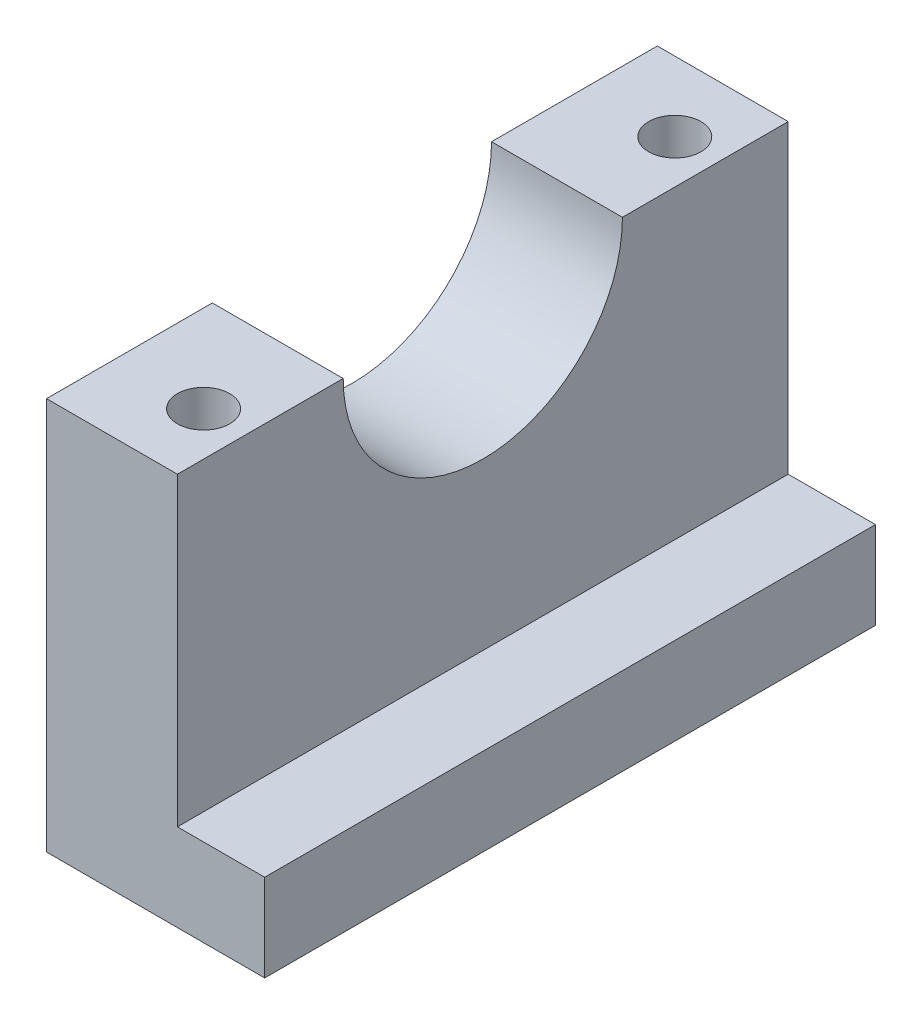
ISO-10303-21;
HEADER;
FILE_DESCRIPTION(('STEP AP214'),'2;1');
FILE_NAME('part.step','',(''),(''),'','','');
FILE_SCHEMA(('AUTOMOTIVE_DESIGN { 1 0 10303 214 1 1 1 1 }'));
ENDSEC;
DATA;
#1=APPLICATION_CONTEXT('core data for automotive mechanical design processes');
#2=APPLICATION_PROTOCOL_DEFINITION('international standard','automotive_design',2000,#1);
#3=PRODUCT_CONTEXT('',#1,'mechanical');
#4=PRODUCT('Part','Part','',(#3));
#5=PRODUCT_RELATED_PRODUCT_CATEGORY('part','',(#4));
#6=PRODUCT_DEFINITION_FORMATION('','',#4);
#7=PRODUCT_DEFINITION_CONTEXT('part definition',#1,'design');
#8=PRODUCT_DEFINITION('design','',#6,#7);
#9=PRODUCT_DEFINITION_SHAPE('','',#8);
#10=(LENGTH_UNIT() NAMED_UNIT(*) SI_UNIT(.MILLI.,.METRE.));
#11=(NAMED_UNIT(*) PLANE_ANGLE_UNIT() SI_UNIT($,.RADIAN.));
#12=(NAMED_UNIT(*) SI_UNIT($,.STERADIAN.) SOLID_ANGLE_UNIT());
#13=UNCERTAINTY_MEASURE_WITH_UNIT(LENGTH_MEASURE(1.E-05),#10,'distance_accuracy_value','');
#14=(GEOMETRIC_REPRESENTATION_CONTEXT(3) GLOBAL_UNCERTAINTY_ASSIGNED_CONTEXT((#13)) GLOBAL_UNIT_ASSIGNED_CONTEXT((#10,
#11,#12)) REPRESENTATION_CONTEXT('',''));
#15=CARTESIAN_POINT('',(0.,0.,0.));
#16=DIRECTION('',(0.,0.,1.));
#17=DIRECTION('',(1.,0.,0.));
#18=AXIS2_PLACEMENT_3D('',#15,#16,#17);
#19=CARTESIAN_POINT('',(10.,45.,27.));
#20=DIRECTION('',(0.,-1.,0.));
#21=DIRECTION('',(0.,0.,-1.));
#22=AXIS2_PLACEMENT_3D('',#19,#20,#21);
#23=CYLINDRICAL_SURFACE('',#22,3.);
#24=CARTESIAN_POINT('',(10.,45.,27.));
#25=DIRECTION('',(0.,1.,0.));
#26=DIRECTION('',(0.,0.,1.));
#27=AXIS2_PLACEMENT_3D('',#24,#25,#26);
#28=CIRCLE('',#27,3.);
#29=CARTESIAN_POINT('',(10.,45.,24.));
#30=VERTEX_POINT('',#29);
#31=EDGE_CURVE('E153',#30,#30,#28,.T.);
#32=CARTESIAN_POINT('',(10.,7.,27.));
#33=DIRECTION('',(0.,-1.,0.));
#34=DIRECTION('',(0.,0.,-1.));
#35=AXIS2_PLACEMENT_3D('',#32,#33,#34);
#36=CIRCLE('',#35,3.);
#37=CARTESIAN_POINT('',(10.,7.,24.));
#38=VERTEX_POINT('',#37);
#39=EDGE_CURVE('E43',#38,#38,#36,.T.);
#40=CARTESIAN_POINT('',(10.,45.,24.));
#41=CARTESIAN_POINT('',(10.,44.6041666666667,24.));
#42=CARTESIAN_POINT('',(10.,44.2083333333333,24.));
#43=CARTESIAN_POINT('',(10.,43.4166666666667,24.));
#44=CARTESIAN_POINT('',(10.,43.0208333333333,24.));
#45=CARTESIAN_POINT('',(10.,42.2291666666667,24.));
#46=CARTESIAN_POINT('',(10.,41.8333333333333,24.));
#47=CARTESIAN_POINT('',(10.,41.0416666666667,24.));
#48=CARTESIAN_POINT('',(10.,40.6458333333333,24.));
#49=CARTESIAN_POINT('',(10.,39.8541666666667,24.));
#50=CARTESIAN_POINT('',(10.,39.4583333333333,24.));
#51=CARTESIAN_POINT('',(10.,38.6666666666667,24.));
#52=CARTESIAN_POINT('',(10.,38.2708333333333,24.));
#53=CARTESIAN_POINT('',(10.,37.4791666666667,24.));
#54=CARTESIAN_POINT('',(10.,37.0833333333333,24.));
#55=CARTESIAN_POINT('',(10.,36.2916666666667,24.));
#56=CARTESIAN_POINT('',(10.,35.8958333333333,24.));
#57=CARTESIAN_POINT('',(10.,35.1041666666667,24.));
#58=CARTESIAN_POINT('',(10.,34.7083333333333,24.));
#59=CARTESIAN_POINT('',(10.,33.9166666666667,24.));
#60=CARTESIAN_POINT('',(10.,33.5208333333333,24.));
#61=CARTESIAN_POINT('',(10.,32.7291666666667,24.));
#62=CARTESIAN_POINT('',(10.,32.3333333333333,24.));
#63=CARTESIAN_POINT('',(10.,31.5416666666667,24.));
#64=CARTESIAN_POINT('',(10.,31.1458333333333,24.));
#65=CARTESIAN_POINT('',(10.,30.3541666666667,24.));
#66=CARTESIAN_POINT('',(10.,29.9583333333333,24.));
#67=CARTESIAN_POINT('',(10.,29.1666666666667,24.));
#68=CARTESIAN_POINT('',(10.,28.7708333333333,24.));
#69=CARTESIAN_POINT('',(10.,27.9791666666667,24.));
#70=CARTESIAN_POINT('',(10.,27.5833333333333,24.));
#71=CARTESIAN_POINT('',(10.,26.7916666666667,24.));
#72=CARTESIAN_POINT('',(10.,26.3958333333333,24.));
#73=CARTESIAN_POINT('',(10.,25.6041666666667,24.));
#74=CARTESIAN_POINT('',(10.,25.2083333333333,24.));
#75=CARTESIAN_POINT('',(10.,24.4166666666667,24.));
#76=CARTESIAN_POINT('',(10.,24.0208333333333,24.));
#77=CARTESIAN_POINT('',(10.,23.2291666666667,24.));
#78=CARTESIAN_POINT('',(10.,22.8333333333333,24.));
#79=CARTESIAN_POINT('',(10.,22.0416666666667,24.));
#80=CARTESIAN_POINT('',(10.,21.6458333333333,24.));
#81=CARTESIAN_POINT('',(10.,20.8541666666667,24.));
#82=CARTESIAN_POINT('',(10.,20.4583333333333,24.));
#83=CARTESIAN_POINT('',(10.,19.6666666666667,24.));
#84=CARTESIAN_POINT('',(10.,19.2708333333333,24.));
#85=CARTESIAN_POINT('',(10.,18.4791666666667,24.));
#86=CARTESIAN_POINT('',(10.,18.0833333333333,24.));
#87=CARTESIAN_POINT('',(10.,17.2916666666667,24.));
#88=CARTESIAN_POINT('',(10.,16.8958333333333,24.));
#89=CARTESIAN_POINT('',(10.,16.1041666666667,24.));
#90=CARTESIAN_POINT('',(10.,15.7083333333333,24.));
#91=CARTESIAN_POINT('',(10.,14.9166666666667,24.));
#92=CARTESIAN_POINT('',(10.,14.5208333333333,24.));
#93=CARTESIAN_POINT('',(10.,13.7291666666667,24.));
#94=CARTESIAN_POINT('',(10.,13.3333333333333,24.));
#95=CARTESIAN_POINT('',(10.,12.5416666666667,24.));
#96=CARTESIAN_POINT('',(10.,12.1458333333333,24.));
#97=CARTESIAN_POINT('',(10.,11.3541666666667,24.));
#98=CARTESIAN_POINT('',(10.,10.9583333333333,24.));
#99=CARTESIAN_POINT('',(10.,10.1666666666667,24.));
#100=CARTESIAN_POINT('',(10.,9.77083333333333,24.));
#101=CARTESIAN_POINT('',(10.,8.97916666666667,24.));
#102=CARTESIAN_POINT('',(10.,8.58333333333333,24.));
#103=CARTESIAN_POINT('',(10.,7.79166666666667,24.));
#104=CARTESIAN_POINT('',(10.,7.39583333333333,24.));
#105=CARTESIAN_POINT('',(10.,7.,24.));
#106=B_SPLINE_CURVE_WITH_KNOTS('',3,(#40,#41,#42,#43,#44,#45,#46,#47,#48,#49,#50,#51,#52,#53,
#54,#55,#56,#57,#58,#59,#60,#61,#62,#63,#64,#65,#66,#67,#68,#69,#70,#71,#72,#73,#74,#75,#76,#77,
#78,#79,#80,#81,#82,#83,#84,#85,#86,#87,#88,#89,#90,#91,#92,#93,#94,#95,#96,#97,#98,#99,#100,
#101,#102,#103,#104,#105),.UNSPECIFIED.,.F.,.F.,(4,2,2,2,2,2,2,2,2,2,2,2,2,2,2,2,2,2,2,2,2,2,2,
2,2,2,2,2,2,2,2,2,4),(0.,1.1875,2.375,3.5625,4.75,5.93750000000001,7.12500000000001,8.3125,9.5,
10.6875,11.875,13.0625,14.25,15.4375,16.625,17.8125,19.,20.1875,21.375,22.5625,23.75,24.9375,
26.125,27.3125,28.5,29.6875,30.875,32.0625,33.25,34.4375,35.625,36.8125,38.),.UNSPECIFIED.);
#107=EDGE_CURVE('BSEAM39',#30,#38,#106,.T.);
#108=ORIENTED_EDGE('',*,*,#31,.T.);
#109=ORIENTED_EDGE('',*,*,#39,.T.);
#110=ORIENTED_EDGE('',*,*,#107,.T.);
#111=ORIENTED_EDGE('',*,*,#107,.F.);
#112=EDGE_LOOP('',(#108,#110,#109,#111));
#113=FACE_BOUND('',#112,.T.);
#114=ADVANCED_FACE('F39',(#113),#23,.F.);
#115=CARTESIAN_POINT('',(10.,45.,-27.));
#116=DIRECTION('',(0.,-1.,0.));
#117=DIRECTION('',(0.,0.,-1.));
#118=AXIS2_PLACEMENT_3D('',#115,#116,#117);
#119=CYLINDRICAL_SURFACE('',#118,3.);
#120=CARTESIAN_POINT('',(10.,45.,-27.));
#121=DIRECTION('',(0.,1.,0.));
#122=DIRECTION('',(0.,0.,1.));
#123=AXIS2_PLACEMENT_3D('',#120,#121,#122);
#124=CIRCLE('',#123,3.);
#125=CARTESIAN_POINT('',(10.,45.,-30.));
#126=VERTEX_POINT('',#125);
#127=EDGE_CURVE('E152',#126,#126,#124,.T.);
#128=CARTESIAN_POINT('',(10.,7.,-27.));
#129=DIRECTION('',(0.,-1.,0.));
#130=DIRECTION('',(0.,0.,-1.));
#131=AXIS2_PLACEMENT_3D('',#128,#129,#130);
#132=CIRCLE('',#131,3.);
#133=CARTESIAN_POINT('',(10.,7.,-30.));
#134=VERTEX_POINT('',#133);
#135=EDGE_CURVE('E204',#134,#134,#132,.T.);
#136=CARTESIAN_POINT('',(10.,45.,-30.));
#137=CARTESIAN_POINT('',(10.,44.6041666666667,-30.));
#138=CARTESIAN_POINT('',(10.,44.2083333333333,-30.));
#139=CARTESIAN_POINT('',(10.,43.4166666666667,-30.));
#140=CARTESIAN_POINT('',(10.,43.0208333333333,-30.));
#141=CARTESIAN_POINT('',(10.,42.2291666666667,-30.));
#142=CARTESIAN_POINT('',(10.,41.8333333333333,-30.));
#143=CARTESIAN_POINT('',(10.,41.0416666666667,-30.));
#144=CARTESIAN_POINT('',(10.,40.6458333333333,-30.));
#145=CARTESIAN_POINT('',(10.,39.8541666666667,-30.));
#146=CARTESIAN_POINT('',(10.,39.4583333333333,-30.));
#147=CARTESIAN_POINT('',(10.,38.6666666666667,-30.));
#148=CARTESIAN_POINT('',(10.,38.2708333333333,-30.));
#149=CARTESIAN_POINT('',(10.,37.4791666666667,-30.));
#150=CARTESIAN_POINT('',(10.,37.0833333333333,-30.));
#151=CARTESIAN_POINT('',(10.,36.2916666666667,-30.));
#152=CARTESIAN_POINT('',(10.,35.8958333333333,-30.));
#153=CARTESIAN_POINT('',(10.,35.1041666666667,-30.));
#154=CARTESIAN_POINT('',(10.,34.7083333333333,-30.));
#155=CARTESIAN_POINT('',(10.,33.9166666666667,-30.));
#156=CARTESIAN_POINT('',(10.,33.5208333333333,-30.));
#157=CARTESIAN_POINT('',(10.,32.7291666666667,-30.));
#158=CARTESIAN_POINT('',(10.,32.3333333333333,-30.));
#159=CARTESIAN_POINT('',(10.,31.5416666666667,-30.));
#160=CARTESIAN_POINT('',(10.,31.1458333333333,-30.));
#161=CARTESIAN_POINT('',(10.,30.3541666666667,-30.));
#162=CARTESIAN_POINT('',(10.,29.9583333333333,-30.));
#163=CARTESIAN_POINT('',(10.,29.1666666666667,-30.));
#164=CARTESIAN_POINT('',(10.,28.7708333333333,-30.));
#165=CARTESIAN_POINT('',(10.,27.9791666666667,-30.));
#166=CARTESIAN_POINT('',(10.,27.5833333333333,-30.));
#167=CARTESIAN_POINT('',(10.,26.7916666666667,-30.));
#168=CARTESIAN_POINT('',(10.,26.3958333333333,-30.));
#169=CARTESIAN_POINT('',(10.,25.6041666666667,-30.));
#170=CARTESIAN_POINT('',(10.,25.2083333333333,-30.));
#171=CARTESIAN_POINT('',(10.,24.4166666666667,-30.));
#172=CARTESIAN_POINT('',(10.,24.0208333333333,-30.));
#173=CARTESIAN_POINT('',(10.,23.2291666666667,-30.));
#174=CARTESIAN_POINT('',(10.,22.8333333333333,-30.));
#175=CARTESIAN_POINT('',(10.,22.0416666666667,-30.));
#176=CARTESIAN_POINT('',(10.,21.6458333333333,-30.));
#177=CARTESIAN_POINT('',(10.,20.8541666666667,-30.));
#178=CARTESIAN_POINT('',(10.,20.4583333333333,-30.));
#179=CARTESIAN_POINT('',(10.,19.6666666666667,-30.));
#180=CARTESIAN_POINT('',(10.,19.2708333333333,-30.));
#181=CARTESIAN_POINT('',(10.,18.4791666666667,-30.));
#182=CARTESIAN_POINT('',(10.,18.0833333333333,-30.));
#183=CARTESIAN_POINT('',(10.,17.2916666666667,-30.));
#184=CARTESIAN_POINT('',(10.,16.8958333333333,-30.));
#185=CARTESIAN_POINT('',(10.,16.1041666666667,-30.));
#186=CARTESIAN_POINT('',(10.,15.7083333333333,-30.));
#187=CARTESIAN_POINT('',(10.,14.9166666666667,-30.));
#188=CARTESIAN_POINT('',(10.,14.5208333333333,-30.));
#189=CARTESIAN_POINT('',(10.,13.7291666666667,-30.));
#190=CARTESIAN_POINT('',(10.,13.3333333333333,-30.));
#191=CARTESIAN_POINT('',(10.,12.5416666666667,-30.));
#192=CARTESIAN_POINT('',(10.,12.1458333333333,-30.));
#193=CARTESIAN_POINT('',(10.,11.3541666666667,-30.));
#194=CARTESIAN_POINT('',(10.,10.9583333333333,-30.));
#195=CARTESIAN_POINT('',(10.,10.1666666666667,-30.));
#196=CARTESIAN_POINT('',(10.,9.77083333333333,-30.));
#197=CARTESIAN_POINT('',(10.,8.97916666666667,-30.));
#198=CARTESIAN_POINT('',(10.,8.58333333333333,-30.));
#199=CARTESIAN_POINT('',(10.,7.79166666666667,-30.));
#200=CARTESIAN_POINT('',(10.,7.39583333333333,-30.));
#201=CARTESIAN_POINT('',(10.,7.,-30.));
#202=B_SPLINE_CURVE_WITH_KNOTS('',3,(#136,#137,#138,#139,#140,#141,#142,#143,#144,#145,#146,
#147,#148,#149,#150,#151,#152,#153,#154,#155,#156,#157,#158,#159,#160,#161,#162,#163,#164,#165,
#166,#167,#168,#169,#170,#171,#172,#173,#174,#175,#176,#177,#178,#179,#180,#181,#182,#183,#184,
#185,#186,#187,#188,#189,#190,#191,#192,#193,#194,#195,#196,#197,#198,#199,#200,#201),
.UNSPECIFIED.,.F.,.F.,(4,2,2,2,2,2,2,2,2,2,2,2,2,2,2,2,2,2,2,2,2,2,2,2,2,2,2,2,2,2,2,2,4),(0.,
1.1875,2.375,3.5625,4.75,5.93750000000001,7.12500000000001,8.3125,9.5,10.6875,11.875,13.0625,
14.25,15.4375,16.625,17.8125,19.,20.1875,21.375,22.5625,23.75,24.9375,26.125,27.3125,28.5,
29.6875,30.875,32.0625,33.25,34.4375,35.625,36.8125,38.),.UNSPECIFIED.);
#203=EDGE_CURVE('BSEAM242',#126,#134,#202,.T.);
#204=ORIENTED_EDGE('',*,*,#127,.T.);
#205=ORIENTED_EDGE('',*,*,#135,.T.);
#206=ORIENTED_EDGE('',*,*,#203,.T.);
#207=ORIENTED_EDGE('',*,*,#203,.F.);
#208=EDGE_LOOP('',(#204,#206,#205,#207));
#209=FACE_BOUND('',#208,.T.);
#210=ADVANCED_FACE('F242',(#209),#119,.F.);
#211=CARTESIAN_POINT('',(15.,0.,35.));
#212=DIRECTION('',(0.,0.,-1.));
#213=DIRECTION('',(-1.,0.,0.));
#214=AXIS2_PLACEMENT_3D('',#211,#212,#213);
#215=PLANE('',#214);
#216=DIRECTION('',(0.,-1.,0.));
#217=VECTOR('',#216,1.);
#218=CARTESIAN_POINT('',(0.,0.,35.));
#219=LINE('',#218,#217);
#220=CARTESIAN_POINT('',(0.,45.,35.));
#221=VERTEX_POINT('',#220);
#222=CARTESIAN_POINT('',(0.,0.,35.));
#223=VERTEX_POINT('',#222);
#224=EDGE_CURVE('E118',#221,#223,#219,.T.);
#225=ORIENTED_EDGE('',*,*,#224,.T.);
#226=DIRECTION('',(-1.,0.,0.));
#227=VECTOR('',#226,1.);
#228=CARTESIAN_POINT('',(15.,0.,35.));
#229=LINE('',#228,#227);
#230=CARTESIAN_POINT('',(25.,0.,35.));
#231=VERTEX_POINT('',#230);
#232=EDGE_CURVE('E11',#231,#223,#229,.T.);
#233=ORIENTED_EDGE('',*,*,#232,.F.);
#234=DIRECTION('',(0.,-1.,0.));
#235=VECTOR('',#234,1.);
#236=CARTESIAN_POINT('',(25.,0.,35.));
#237=LINE('',#236,#235);
#238=CARTESIAN_POINT('',(25.,10.,35.));
#239=VERTEX_POINT('',#238);
#240=EDGE_CURVE('E116',#239,#231,#237,.T.);
#241=ORIENTED_EDGE('',*,*,#240,.F.);
#242=DIRECTION('',(-1.,0.,0.));
#243=VECTOR('',#242,1.);
#244=CARTESIAN_POINT('',(25.,10.,35.));
#245=LINE('',#244,#243);
#246=CARTESIAN_POINT('',(15.,10.,35.));
#247=VERTEX_POINT('',#246);
#248=EDGE_CURVE('E144',#239,#247,#245,.T.);
#249=ORIENTED_EDGE('',*,*,#248,.T.);
#250=DIRECTION('',(0.,-1.,0.));
#251=VECTOR('',#250,1.);
#252=CARTESIAN_POINT('',(15.,0.,35.));
#253=LINE('',#252,#251);
#254=CARTESIAN_POINT('',(15.,45.,35.));
#255=VERTEX_POINT('',#254);
#256=EDGE_CURVE('E160',#255,#247,#253,.T.);
#257=ORIENTED_EDGE('',*,*,#256,.F.);
#258=DIRECTION('',(-1.,0.,0.));
#259=VECTOR('',#258,1.);
#260=CARTESIAN_POINT('',(15.,45.,35.));
#261=LINE('',#260,#259);
#262=EDGE_CURVE('E173',#255,#221,#261,.T.);
#263=ORIENTED_EDGE('',*,*,#262,.T.);
#264=EDGE_LOOP('',(#225,#233,#241,#249,#257,#263));
#265=FACE_BOUND('',#264,.T.);
#266=ADVANCED_FACE('F41',(#265),#215,.F.);
#267=CARTESIAN_POINT('',(15.,0.,35.));
#268=DIRECTION('',(0.,1.,0.));
#269=DIRECTION('',(0.,0.,1.));
#270=AXIS2_PLACEMENT_3D('',#267,#268,#269);
#271=PLANE('',#270);
#272=CARTESIAN_POINT('',(10.,0.,27.));
#273=DIRECTION('',(0.,-1.,0.));
#274=DIRECTION('',(0.,0.,-1.));
#275=AXIS2_PLACEMENT_3D('',#272,#273,#274);
#276=CIRCLE('',#275,6.);
#277=CARTESIAN_POINT('',(10.,0.,21.));
#278=VERTEX_POINT('',#277);
#279=EDGE_CURVE('E214',#278,#278,#276,.T.);
#280=ORIENTED_EDGE('',*,*,#279,.F.);
#281=EDGE_LOOP('',(#280));
#282=FACE_BOUND('',#281,.T.);
#283=CARTESIAN_POINT('',(10.,0.,-27.));
#284=DIRECTION('',(0.,-1.,0.));
#285=DIRECTION('',(0.,0.,-1.));
#286=AXIS2_PLACEMENT_3D('',#283,#284,#285);
#287=CIRCLE('',#286,6.);
#288=CARTESIAN_POINT('',(10.,0.,-33.));
#289=VERTEX_POINT('',#288);
#290=EDGE_CURVE('E138',#289,#289,#287,.T.);
#291=ORIENTED_EDGE('',*,*,#290,.F.);
#292=EDGE_LOOP('',(#291));
#293=FACE_BOUND('',#292,.T.);
#294=DIRECTION('',(0.,0.,-1.));
#295=VECTOR('',#294,1.);
#296=CARTESIAN_POINT('',(0.,0.,35.));
#297=LINE('',#296,#295);
#298=CARTESIAN_POINT('',(0.,0.,-35.));
#299=VERTEX_POINT('',#298);
#300=EDGE_CURVE('E176',#223,#299,#297,.T.);
#301=ORIENTED_EDGE('',*,*,#300,.T.);
#302=DIRECTION('',(-1.,0.,0.));
#303=VECTOR('',#302,1.);
#304=CARTESIAN_POINT('',(15.,0.,-35.));
#305=LINE('',#304,#303);
#306=CARTESIAN_POINT('',(25.,0.,-35.));
#307=VERTEX_POINT('',#306);
#308=EDGE_CURVE('E49',#307,#299,#305,.T.);
#309=ORIENTED_EDGE('',*,*,#308,.F.);
#310=DIRECTION('',(0.,0.,-1.));
#311=VECTOR('',#310,1.);
#312=CARTESIAN_POINT('',(25.,0.,35.));
#313=LINE('',#312,#311);
#314=EDGE_CURVE('E121',#231,#307,#313,.T.);
#315=ORIENTED_EDGE('',*,*,#314,.F.);
#316=ORIENTED_EDGE('',*,*,#232,.T.);
#317=EDGE_LOOP('',(#301,#309,#315,#316));
#318=FACE_BOUND('',#317,.T.);
#319=ADVANCED_FACE('F122',(#282,#293,#318),#271,.F.);
#320=CARTESIAN_POINT('',(15.,0.,-35.));
#321=DIRECTION('',(0.,0.,1.));
#322=DIRECTION('',(1.,0.,0.));
#323=AXIS2_PLACEMENT_3D('',#320,#321,#322);
#324=PLANE('',#323);
#325=DIRECTION('',(0.,1.,0.));
#326=VECTOR('',#325,1.);
#327=CARTESIAN_POINT('',(0.,0.,-35.));
#328=LINE('',#327,#326);
#329=CARTESIAN_POINT('',(0.,45.,-35.));
#330=VERTEX_POINT('',#329);
#331=EDGE_CURVE('E179',#299,#330,#328,.T.);
#332=ORIENTED_EDGE('',*,*,#331,.T.);
#333=DIRECTION('',(-1.,0.,0.));
#334=VECTOR('',#333,1.);
#335=CARTESIAN_POINT('',(15.,45.,-35.));
#336=LINE('',#335,#334);
#337=CARTESIAN_POINT('',(15.,45.,-35.));
#338=VERTEX_POINT('',#337);
#339=EDGE_CURVE('E199',#338,#330,#336,.T.);
#340=ORIENTED_EDGE('',*,*,#339,.F.);
#341=DIRECTION('',(0.,1.,0.));
#342=VECTOR('',#341,1.);
#343=CARTESIAN_POINT('',(15.,0.,-35.));
#344=LINE('',#343,#342);
#345=CARTESIAN_POINT('',(15.,10.,-35.));
#346=VERTEX_POINT('',#345);
#347=EDGE_CURVE('E95',#346,#338,#344,.T.);
#348=ORIENTED_EDGE('',*,*,#347,.F.);
#349=DIRECTION('',(-1.,0.,0.));
#350=VECTOR('',#349,1.);
#351=CARTESIAN_POINT('',(25.,10.,-35.));
#352=LINE('',#351,#350);
#353=CARTESIAN_POINT('',(25.,10.,-35.));
#354=VERTEX_POINT('',#353);
#355=EDGE_CURVE('E148',#354,#346,#352,.T.);
#356=ORIENTED_EDGE('',*,*,#355,.F.);
#357=DIRECTION('',(0.,1.,0.));
#358=VECTOR('',#357,1.);
#359=CARTESIAN_POINT('',(25.,0.,-35.));
#360=LINE('',#359,#358);
#361=EDGE_CURVE('E127',#307,#354,#360,.T.);
#362=ORIENTED_EDGE('',*,*,#361,.F.);
#363=ORIENTED_EDGE('',*,*,#308,.T.);
#364=EDGE_LOOP('',(#332,#340,#348,#356,#362,#363));
#365=FACE_BOUND('',#364,.T.);
#366=ADVANCED_FACE('F233',(#365),#324,.F.);
#367=CARTESIAN_POINT('',(15.,45.,-16.));
#368=DIRECTION('',(0.,-1.,0.));
#369=DIRECTION('',(0.,0.,-1.));
#370=AXIS2_PLACEMENT_3D('',#367,#368,#369);
#371=PLANE('',#370);
#372=ORIENTED_EDGE('',*,*,#127,.F.);
#373=EDGE_LOOP('',(#372));
#374=FACE_BOUND('',#373,.T.);
#375=DIRECTION('',(0.,0.,1.));
#376=VECTOR('',#375,1.);
#377=CARTESIAN_POINT('',(0.,45.,-16.));
#378=LINE('',#377,#376);
#379=CARTESIAN_POINT('',(0.,45.,-16.));
#380=VERTEX_POINT('',#379);
#381=EDGE_CURVE('E182',#330,#380,#378,.T.);
#382=ORIENTED_EDGE('',*,*,#381,.T.);
#383=DIRECTION('',(-1.,0.,0.));
#384=VECTOR('',#383,1.);
#385=CARTESIAN_POINT('',(15.,45.,-16.));
#386=LINE('',#385,#384);
#387=CARTESIAN_POINT('',(15.,45.,-16.));
#388=VERTEX_POINT('',#387);
#389=EDGE_CURVE('E195',#388,#380,#386,.T.);
#390=ORIENTED_EDGE('',*,*,#389,.F.);
#391=DIRECTION('',(0.,0.,1.));
#392=VECTOR('',#391,1.);
#393=CARTESIAN_POINT('',(15.,45.,-16.));
#394=LINE('',#393,#392);
#395=EDGE_CURVE('E165',#338,#388,#394,.T.);
#396=ORIENTED_EDGE('',*,*,#395,.F.);
#397=ORIENTED_EDGE('',*,*,#339,.T.);
#398=EDGE_LOOP('',(#382,#390,#396,#397));
#399=FACE_BOUND('',#398,.T.);
#400=ADVANCED_FACE('F239',(#374,#399),#371,.F.);
#401=CARTESIAN_POINT('',(15.,45.,0.));
#402=DIRECTION('',(-1.,0.,0.));
#403=DIRECTION('',(0.,0.,1.));
#404=AXIS2_PLACEMENT_3D('',#401,#402,#403);
#405=CYLINDRICAL_SURFACE('',#404,16.);
#406=CARTESIAN_POINT('',(0.,45.,0.));
#407=DIRECTION('',(-1.,0.,0.));
#408=DIRECTION('',(0.,0.,-1.));
#409=AXIS2_PLACEMENT_3D('',#406,#407,#408);
#410=CIRCLE('',#409,16.);
#411=CARTESIAN_POINT('',(0.,45.,16.));
#412=VERTEX_POINT('',#411);
#413=EDGE_CURVE('E185',#380,#412,#410,.T.);
#414=ORIENTED_EDGE('',*,*,#413,.T.);
#415=DIRECTION('',(-1.,0.,0.));
#416=VECTOR('',#415,1.);
#417=CARTESIAN_POINT('',(15.,45.,16.));
#418=LINE('',#417,#416);
#419=CARTESIAN_POINT('',(15.,45.,16.));
#420=VERTEX_POINT('',#419);
#421=EDGE_CURVE('E192',#420,#412,#418,.T.);
#422=ORIENTED_EDGE('',*,*,#421,.F.);
#423=CARTESIAN_POINT('',(15.,45.,0.));
#424=DIRECTION('',(-1.,0.,0.));
#425=DIRECTION('',(0.,0.,-1.));
#426=AXIS2_PLACEMENT_3D('',#423,#424,#425);
#427=CIRCLE('',#426,16.);
#428=EDGE_CURVE('E168',#388,#420,#427,.T.);
#429=ORIENTED_EDGE('',*,*,#428,.F.);
#430=ORIENTED_EDGE('',*,*,#389,.T.);
#431=EDGE_LOOP('',(#414,#422,#429,#430));
#432=FACE_BOUND('',#431,.T.);
#433=ADVANCED_FACE('F268',(#432),#405,.F.);
#434=CARTESIAN_POINT('',(15.,45.,35.));
#435=DIRECTION('',(0.,-1.,0.));
#436=DIRECTION('',(0.,0.,-1.));
#437=AXIS2_PLACEMENT_3D('',#434,#435,#436);
#438=PLANE('',#437);
#439=ORIENTED_EDGE('',*,*,#31,.F.);
#440=EDGE_LOOP('',(#439));
#441=FACE_BOUND('',#440,.T.);
#442=DIRECTION('',(0.,0.,1.));
#443=VECTOR('',#442,1.);
#444=CARTESIAN_POINT('',(0.,45.,35.));
#445=LINE('',#444,#443);
#446=EDGE_CURVE('E91',#412,#221,#445,.T.);
#447=ORIENTED_EDGE('',*,*,#446,.T.);
#448=ORIENTED_EDGE('',*,*,#262,.F.);
#449=DIRECTION('',(0.,0.,1.));
#450=VECTOR('',#449,1.);
#451=CARTESIAN_POINT('',(15.,45.,35.));
#452=LINE('',#451,#450);
#453=EDGE_CURVE('E64',#420,#255,#452,.T.);
#454=ORIENTED_EDGE('',*,*,#453,.F.);
#455=ORIENTED_EDGE('',*,*,#421,.T.);
#456=EDGE_LOOP('',(#447,#448,#454,#455));
#457=FACE_BOUND('',#456,.T.);
#458=ADVANCED_FACE('F262',(#441,#457),#438,.F.);
#459=CARTESIAN_POINT('',(15.,45.,0.));
#460=DIRECTION('',(1.,0.,0.));
#461=DIRECTION('',(0.,0.,-1.));
#462=AXIS2_PLACEMENT_3D('',#459,#460,#461);
#463=PLANE('',#462);
#464=DIRECTION('',(0.,0.,1.));
#465=VECTOR('',#464,1.);
#466=CARTESIAN_POINT('',(15.,10.,35.));
#467=LINE('',#466,#465);
#468=EDGE_CURVE('E57',#346,#247,#467,.T.);
#469=ORIENTED_EDGE('',*,*,#468,.F.);
#470=ORIENTED_EDGE('',*,*,#347,.T.);
#471=ORIENTED_EDGE('',*,*,#395,.T.);
#472=ORIENTED_EDGE('',*,*,#428,.T.);
#473=ORIENTED_EDGE('',*,*,#453,.T.);
#474=ORIENTED_EDGE('',*,*,#256,.T.);
#475=EDGE_LOOP('',(#469,#470,#471,#472,#473,#474));
#476=FACE_BOUND('',#475,.T.);
#477=ADVANCED_FACE('F258',(#476),#463,.T.);
#478=CARTESIAN_POINT('',(0.,45.,0.));
#479=DIRECTION('',(1.,0.,0.));
#480=DIRECTION('',(0.,0.,-1.));
#481=AXIS2_PLACEMENT_3D('',#478,#479,#480);
#482=PLANE('',#481);
#483=ORIENTED_EDGE('',*,*,#224,.F.);
#484=ORIENTED_EDGE('',*,*,#446,.F.);
#485=ORIENTED_EDGE('',*,*,#413,.F.);
#486=ORIENTED_EDGE('',*,*,#381,.F.);
#487=ORIENTED_EDGE('',*,*,#331,.F.);
#488=ORIENTED_EDGE('',*,*,#300,.F.);
#489=EDGE_LOOP('',(#483,#484,#485,#486,#487,#488));
#490=FACE_BOUND('',#489,.T.);
#491=ADVANCED_FACE('F261',(#490),#482,.F.);
#492=CARTESIAN_POINT('',(25.,10.,35.));
#493=DIRECTION('',(0.,-1.,0.));
#494=DIRECTION('',(0.,0.,-1.));
#495=AXIS2_PLACEMENT_3D('',#492,#493,#494);
#496=PLANE('',#495);
#497=ORIENTED_EDGE('',*,*,#468,.T.);
#498=ORIENTED_EDGE('',*,*,#248,.F.);
#499=DIRECTION('',(0.,0.,1.));
#500=VECTOR('',#499,1.);
#501=CARTESIAN_POINT('',(25.,10.,35.));
#502=LINE('',#501,#500);
#503=EDGE_CURVE('E131',#354,#239,#502,.T.);
#504=ORIENTED_EDGE('',*,*,#503,.F.);
#505=ORIENTED_EDGE('',*,*,#355,.T.);
#506=EDGE_LOOP('',(#497,#498,#504,#505));
#507=FACE_BOUND('',#506,.T.);
#508=ADVANCED_FACE('F255',(#507),#496,.F.);
#509=CARTESIAN_POINT('',(25.,0.,0.));
#510=DIRECTION('',(-1.,0.,0.));
#511=DIRECTION('',(0.,0.,1.));
#512=AXIS2_PLACEMENT_3D('',#509,#510,#511);
#513=PLANE('',#512);
#514=ORIENTED_EDGE('',*,*,#240,.T.);
#515=ORIENTED_EDGE('',*,*,#314,.T.);
#516=ORIENTED_EDGE('',*,*,#361,.T.);
#517=ORIENTED_EDGE('',*,*,#503,.T.);
#518=EDGE_LOOP('',(#514,#515,#516,#517));
#519=FACE_BOUND('',#518,.T.);
#520=ADVANCED_FACE('F129',(#519),#513,.F.);
#521=CARTESIAN_POINT('',(10.,7.,-27.));
#522=DIRECTION('',(0.,-1.,0.));
#523=DIRECTION('',(0.,0.,-1.));
#524=AXIS2_PLACEMENT_3D('',#521,#522,#523);
#525=CYLINDRICAL_SURFACE('',#524,6.);
#526=CARTESIAN_POINT('',(10.,7.,-27.));
#527=DIRECTION('',(0.,-1.,0.));
#528=DIRECTION('',(0.,0.,-1.));
#529=AXIS2_PLACEMENT_3D('',#526,#527,#528);
#530=CIRCLE('',#529,6.);
#531=CARTESIAN_POINT('',(10.,7.,-33.));
#532=VERTEX_POINT('',#531);
#533=EDGE_CURVE('E220',#532,#532,#530,.T.);
#534=ORIENTED_EDGE('',*,*,#533,.F.);
#535=EDGE_LOOP('',(#534));
#536=FACE_BOUND('',#535,.T.);
#537=ORIENTED_EDGE('',*,*,#290,.T.);
#538=EDGE_LOOP('',(#537));
#539=FACE_BOUND('',#538,.T.);
#540=ADVANCED_FACE('F230',(#536,#539),#525,.F.);
#541=CARTESIAN_POINT('',(10.,7.,-27.));
#542=DIRECTION('',(0.,-1.,0.));
#543=DIRECTION('',(0.,0.,-1.));
#544=AXIS2_PLACEMENT_3D('',#541,#542,#543);
#545=PLANE('',#544);
#546=ORIENTED_EDGE('',*,*,#135,.F.);
#547=EDGE_LOOP('',(#546));
#548=FACE_BOUND('',#547,.T.);
#549=ORIENTED_EDGE('',*,*,#533,.T.);
#550=EDGE_LOOP('',(#549));
#551=FACE_BOUND('',#550,.T.);
#552=ADVANCED_FACE('F295',(#548,#551),#545,.T.);
#553=CARTESIAN_POINT('',(10.,7.,27.));
#554=DIRECTION('',(0.,-1.,0.));
#555=DIRECTION('',(0.,0.,-1.));
#556=AXIS2_PLACEMENT_3D('',#553,#554,#555);
#557=CYLINDRICAL_SURFACE('',#556,6.);
#558=CARTESIAN_POINT('',(10.,7.,27.));
#559=DIRECTION('',(0.,-1.,0.));
#560=DIRECTION('',(0.,0.,-1.));
#561=AXIS2_PLACEMENT_3D('',#558,#559,#560);
#562=CIRCLE('',#561,6.);
#563=CARTESIAN_POINT('',(10.,7.,21.));
#564=VERTEX_POINT('',#563);
#565=EDGE_CURVE('E207',#564,#564,#562,.T.);
#566=ORIENTED_EDGE('',*,*,#565,.F.);
#567=EDGE_LOOP('',(#566));
#568=FACE_BOUND('',#567,.T.);
#569=ORIENTED_EDGE('',*,*,#279,.T.);
#570=EDGE_LOOP('',(#569));
#571=FACE_BOUND('',#570,.T.);
#572=ADVANCED_FACE('F301',(#568,#571),#557,.F.);
#573=CARTESIAN_POINT('',(10.,7.,27.));
#574=DIRECTION('',(0.,-1.,0.));
#575=DIRECTION('',(0.,0.,-1.));
#576=AXIS2_PLACEMENT_3D('',#573,#574,#575);
#577=PLANE('',#576);
#578=ORIENTED_EDGE('',*,*,#39,.F.);
#579=EDGE_LOOP('',(#578));
#580=FACE_BOUND('',#579,.T.);
#581=ORIENTED_EDGE('',*,*,#565,.T.);
#582=EDGE_LOOP('',(#581));
#583=FACE_BOUND('',#582,.T.);
#584=ADVANCED_FACE('F305',(#580,#583),#577,.T.);
#585=CLOSED_SHELL('',(#114,#210,#266,#319,#366,#400,#433,#458,#477,#491,#508,#520,#540,#552,
#572,#584));
#586=MANIFOLD_SOLID_BREP('B2',#585);
#587=ADVANCED_BREP_SHAPE_REPRESENTATION('',(#18,#586),#14);
#588=SHAPE_DEFINITION_REPRESENTATION(#9,#587);
ENDSEC;
END-ISO-10303-21;
